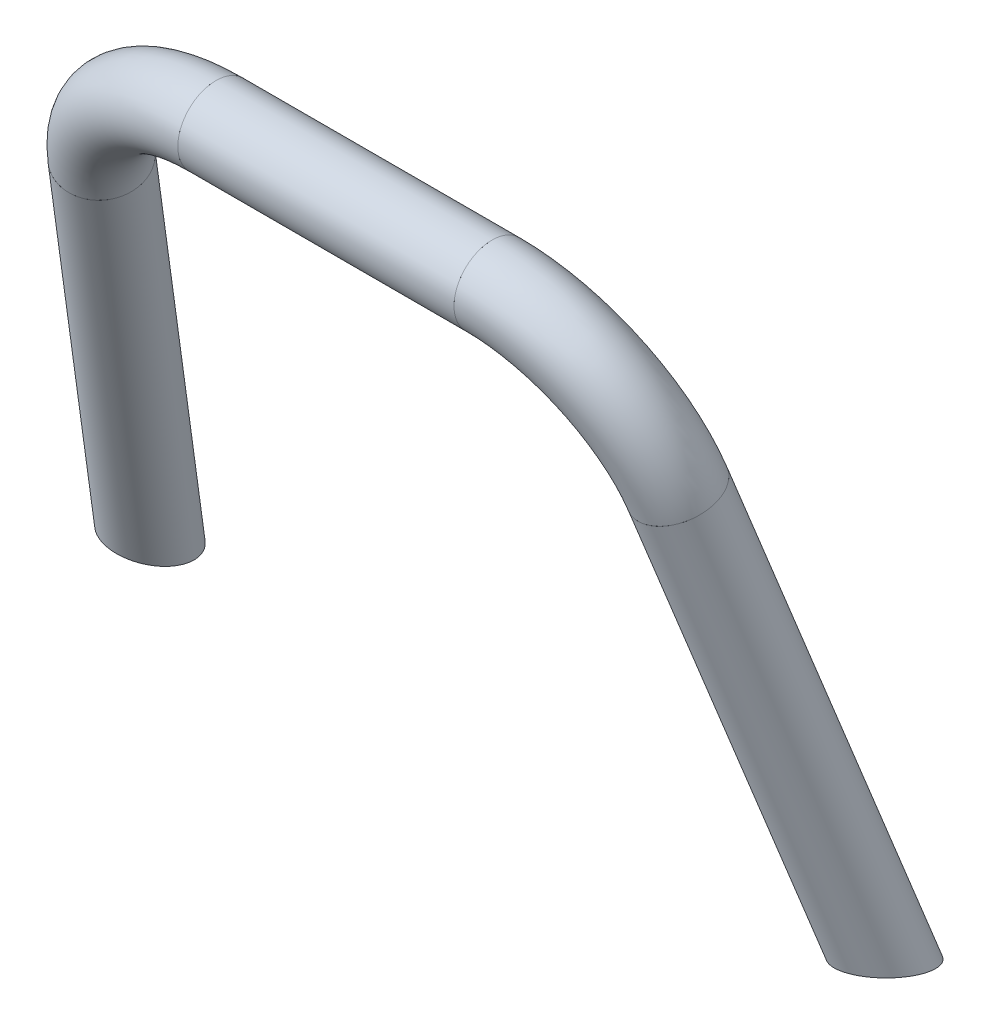
ISO-10303-21;
HEADER;
FILE_DESCRIPTION(('STEP AP214'),'2;1');
FILE_NAME('part.step','',(''),(''),'','','');
FILE_SCHEMA(('AUTOMOTIVE_DESIGN { 1 0 10303 214 1 1 1 1 }'));
ENDSEC;
DATA;
#1=APPLICATION_CONTEXT('core data for automotive mechanical design processes');
#2=APPLICATION_PROTOCOL_DEFINITION('international standard','automotive_design',2000,#1);
#3=PRODUCT_CONTEXT('',#1,'mechanical');
#4=PRODUCT('Part','Part','',(#3));
#5=PRODUCT_RELATED_PRODUCT_CATEGORY('part','',(#4));
#6=PRODUCT_DEFINITION_FORMATION('','',#4);
#7=PRODUCT_DEFINITION_CONTEXT('part definition',#1,'design');
#8=PRODUCT_DEFINITION('design','',#6,#7);
#9=PRODUCT_DEFINITION_SHAPE('','',#8);
#10=(LENGTH_UNIT() NAMED_UNIT(*) SI_UNIT(.MILLI.,.METRE.));
#11=(NAMED_UNIT(*) PLANE_ANGLE_UNIT() SI_UNIT($,.RADIAN.));
#12=(NAMED_UNIT(*) SI_UNIT($,.STERADIAN.) SOLID_ANGLE_UNIT());
#13=UNCERTAINTY_MEASURE_WITH_UNIT(LENGTH_MEASURE(1.E-05),#10,'distance_accuracy_value','');
#14=(GEOMETRIC_REPRESENTATION_CONTEXT(3) GLOBAL_UNCERTAINTY_ASSIGNED_CONTEXT((#13)) GLOBAL_UNIT_ASSIGNED_CONTEXT((#10,
#11,#12)) REPRESENTATION_CONTEXT('',''));
#15=CARTESIAN_POINT('',(0.,0.,0.));
#16=DIRECTION('',(0.,0.,1.));
#17=DIRECTION('',(1.,0.,0.));
#18=AXIS2_PLACEMENT_3D('',#15,#16,#17);
#19=CARTESIAN_POINT('',(72.0514794419109,-176.256250492202,554.703302731316));
#20=DIRECTION('',(0.173648177666935,-0.944253108639308,-0.279700513438851));
#21=DIRECTION('',(0.,0.284015344703917,-0.958819734868198));
#22=AXIS2_PLACEMENT_3D('',#19,#20,#21);
#23=CYLINDRICAL_SURFACE('',#22,6.35);
#24=CARTESIAN_POINT('',(72.0514794419109,-176.256250492202,554.703302731316));
#25=DIRECTION('',(-0.17364817766693,0.944253108639308,0.279700513438852));
#26=DIRECTION('',(0.,-0.284015344703918,0.958819734868197));
#27=AXIS2_PLACEMENT_3D('',#24,#25,#26);
#28=CIRCLE('',#27,6.35);
#29=CARTESIAN_POINT('',(72.0514794419109,-178.059747931072,560.791808047729));
#30=VERTEX_POINT('',#29);
#31=EDGE_CURVE('E66',#30,#30,#28,.T.);
#32=ORIENTED_EDGE('',*,*,#31,.T.);
#33=EDGE_LOOP('',(#32));
#34=FACE_BOUND('',#33,.T.);
#35=CARTESIAN_POINT('',(91.8525605331784,-283.929320408954,522.809086377979));
#36=DIRECTION('',(0.147129774889394,-0.962213086003595,0.229126180224866));
#37=DIRECTION('',(0.0925781956560799,-0.217233957131661,-0.971719447967359));
#38=AXIS2_PLACEMENT_3D('',#35,#36,#37);
#39=ELLIPSE('',#38,7.2985585931813,6.35);
#40=CARTESIAN_POINT('',(92.5282479186253,-285.514815173508,515.716935050855));
#41=VERTEX_POINT('',#40);
#42=EDGE_CURVE('E53',#41,#41,#39,.T.);
#43=ORIENTED_EDGE('',*,*,#42,.T.);
#44=EDGE_LOOP('',(#43));
#45=FACE_BOUND('',#44,.T.);
#46=ADVANCED_FACE('F49',(#34,#45),#23,.F.);
#47=CARTESIAN_POINT('',(72.0514794419109,-176.256250492202,554.703302731316));
#48=DIRECTION('',(0.173648177666935,-0.944253108639308,-0.279700513438851));
#49=DIRECTION('',(0.,0.284015344703917,-0.958819734868198));
#50=AXIS2_PLACEMENT_3D('',#47,#48,#49);
#51=CYLINDRICAL_SURFACE('',#50,9.525);
#52=CARTESIAN_POINT('',(72.0514794419109,-176.256250492202,554.703302731316));
#53=DIRECTION('',(-0.17364817766693,0.944253108639308,0.279700513438852));
#54=DIRECTION('',(0.,-0.284015344703918,0.958819734868197));
#55=AXIS2_PLACEMENT_3D('',#52,#53,#54);
#56=CIRCLE('',#55,9.525);
#57=CARTESIAN_POINT('',(72.0514794419109,-178.961496650507,563.836060705935));
#58=VERTEX_POINT('',#57);
#59=EDGE_CURVE('E58',#58,#58,#56,.T.);
#60=ORIENTED_EDGE('',*,*,#59,.F.);
#61=EDGE_LOOP('',(#60));
#62=FACE_BOUND('',#61,.T.);
#63=CARTESIAN_POINT('',(91.8525605331784,-283.929320408954,522.809086377979));
#64=DIRECTION('',(0.147129774889394,-0.962213086003595,0.229126180224866));
#65=DIRECTION('',(0.0925781956560799,-0.217233957131661,-0.971719447967359));
#66=AXIS2_PLACEMENT_3D('',#63,#64,#65);
#67=ELLIPSE('',#66,10.9478378897719,9.525);
#68=CARTESIAN_POINT('',(92.8660916113488,-286.307562555785,512.170859387294));
#69=VERTEX_POINT('',#68);
#70=EDGE_CURVE('E11',#69,#69,#67,.T.);
#71=ORIENTED_EDGE('',*,*,#70,.F.);
#72=EDGE_LOOP('',(#71));
#73=FACE_BOUND('',#72,.T.);
#74=ADVANCED_FACE('F80',(#62,#73),#51,.T.);
#75=CARTESIAN_POINT('',(72.0514794419109,-176.256250492202,554.703302731316));
#76=DIRECTION('',(-0.17364817766693,0.944253108639308,0.279700513438852));
#77=DIRECTION('',(0.,-0.284015344703918,0.958819734868197));
#78=AXIS2_PLACEMENT_3D('',#75,#76,#77);
#79=PLANE('',#78);
#80=ORIENTED_EDGE('',*,*,#31,.F.);
#81=EDGE_LOOP('',(#80));
#82=FACE_BOUND('',#81,.T.);
#83=ORIENTED_EDGE('',*,*,#59,.T.);
#84=EDGE_LOOP('',(#83));
#85=FACE_BOUND('',#84,.T.);
#86=ADVANCED_FACE('F76',(#82,#85),#79,.T.);
#87=CARTESIAN_POINT('',(100.732882896863,-281.193046525252,528.597681579852));
#88=DIRECTION('',(0.147129774889394,-0.962213086003595,0.229126180224866));
#89=DIRECTION('',(0.,-0.231647150536709,-0.972799875435964));
#90=AXIS2_PLACEMENT_3D('',#87,#88,#89);
#91=PLANE('',#90);
#92=ORIENTED_EDGE('',*,*,#42,.F.);
#93=EDGE_LOOP('',(#92));
#94=FACE_BOUND('',#93,.T.);
#95=ORIENTED_EDGE('',*,*,#70,.T.);
#96=EDGE_LOOP('',(#95));
#97=FACE_BOUND('',#96,.T.);
#98=ADVANCED_FACE('F51',(#94,#97),#91,.T.);
#99=CLOSED_SHELL('',(#46,#74,#86,#98));
#100=MANIFOLD_SOLID_BREP('B2',#99);
#101=CARTESIAN_POINT('',(34.5303040521457,-182.599797609666,552.824258469195));
#102=DIRECTION('',(0.,0.284015344703917,-0.958819734868197));
#103=DIRECTION('',(0.,0.958819734868196,0.284015344703916));
#104=AXIS2_PLACEMENT_3D('',#101,#102,#103);
#105=TOROIDAL_SURFACE('',#104,38.1,6.35);
#106=CARTESIAN_POINT('',(34.5303040521459,-146.068765711187,563.645243102415));
#107=DIRECTION('',(-1.,0.,0.));
#108=DIRECTION('',(0.,-1.,0.));
#109=AXIS2_PLACEMENT_3D('',#106,#107,#108);
#110=CIRCLE('',#109,6.35);
#111=CARTESIAN_POINT('',(34.5303040521459,-139.980260394774,565.448740541284));
#112=VERTEX_POINT('',#111);
#113=EDGE_CURVE('E140',#112,#112,#110,.F.);
#114=CARTESIAN_POINT('',(72.0514794419109,-176.256250492202,554.703302731316));
#115=DIRECTION('',(0.173648177666929,-0.94425310863931,-0.279700513438852));
#116=DIRECTION('',(0.,0.284015344703918,-0.958819734868197));
#117=AXIS2_PLACEMENT_3D('',#114,#115,#116);
#118=CIRCLE('',#117,6.35);
#119=CARTESIAN_POINT('',(78.3050086735384,-175.198992639292,555.016476775002));
#120=VERTEX_POINT('',#119);
#121=EDGE_CURVE('E48',#120,#120,#118,.F.);
#122=CARTESIAN_POINT('',(34.5303040521457,-182.599797609666,552.824258469195));
#123=DIRECTION('',(0.,0.284015344703917,-0.958819734868197));
#124=DIRECTION('',(0.,0.958819734868196,0.284015344703916));
#125=AXIS2_PLACEMENT_3D('',#122,#123,#124);
#126=CIRCLE('',#125,44.45);
#127=EDGE_CURVE('',#112,#120,#126,.T.);
#128=ORIENTED_EDGE('',*,*,#113,.F.);
#129=ORIENTED_EDGE('',*,*,#121,.F.);
#130=ORIENTED_EDGE('',*,*,#127,.T.);
#131=ORIENTED_EDGE('',*,*,#127,.F.);
#132=EDGE_LOOP('',(#128,#130,#129,#131));
#133=FACE_BOUND('',#132,.T.);
#134=ADVANCED_FACE('F126',(#133),#105,.F.);
#135=CARTESIAN_POINT('',(34.5303040521457,-182.599797609666,552.824258469195));
#136=DIRECTION('',(0.,0.284015344703917,-0.958819734868197));
#137=DIRECTION('',(0.,0.958819734868196,0.284015344703916));
#138=AXIS2_PLACEMENT_3D('',#135,#136,#137);
#139=TOROIDAL_SURFACE('',#138,38.1,9.525);
#140=CARTESIAN_POINT('',(34.5303040521459,-146.068765711187,563.645243102415));
#141=DIRECTION('',(-1.,0.,0.));
#142=DIRECTION('',(0.,-1.,0.));
#143=AXIS2_PLACEMENT_3D('',#140,#141,#142);
#144=CIRCLE('',#143,9.525);
#145=CARTESIAN_POINT('',(34.5303040521459,-136.936007736568,566.350489260719));
#146=VERTEX_POINT('',#145);
#147=EDGE_CURVE('E146',#146,#146,#144,.T.);
#148=CARTESIAN_POINT('',(72.0514794419109,-176.256250492202,554.703302731316));
#149=DIRECTION('',(0.173648177666929,-0.94425310863931,-0.279700513438852));
#150=DIRECTION('',(0.,0.284015344703918,-0.958819734868197));
#151=AXIS2_PLACEMENT_3D('',#148,#149,#150);
#152=CIRCLE('',#151,9.525);
#153=CARTESIAN_POINT('',(81.4317732893521,-174.670363712836,555.173063796846));
#154=VERTEX_POINT('',#153);
#155=EDGE_CURVE('E134',#154,#154,#152,.T.);
#156=CARTESIAN_POINT('',(34.5303040521457,-182.599797609666,552.824258469195));
#157=DIRECTION('',(0.,0.284015344703917,-0.958819734868197));
#158=DIRECTION('',(0.,0.958819734868196,0.284015344703916));
#159=AXIS2_PLACEMENT_3D('',#156,#157,#158);
#160=CIRCLE('',#159,47.625);
#161=EDGE_CURVE('',#146,#154,#160,.T.);
#162=ORIENTED_EDGE('',*,*,#147,.F.);
#163=ORIENTED_EDGE('',*,*,#155,.F.);
#164=ORIENTED_EDGE('',*,*,#161,.T.);
#165=ORIENTED_EDGE('',*,*,#161,.F.);
#166=EDGE_LOOP('',(#162,#164,#163,#165));
#167=FACE_BOUND('',#166,.T.);
#168=ADVANCED_FACE('F154',(#167),#139,.T.);
#169=CARTESIAN_POINT('',(34.5303040521458,-146.068765711187,563.645243102414));
#170=DIRECTION('',(-1.,0.,0.));
#171=DIRECTION('',(0.,-1.,0.));
#172=AXIS2_PLACEMENT_3D('',#169,#170,#171);
#173=PLANE('',#172);
#174=ORIENTED_EDGE('',*,*,#147,.T.);
#175=EDGE_LOOP('',(#174));
#176=FACE_BOUND('',#175,.T.);
#177=ORIENTED_EDGE('',*,*,#113,.T.);
#178=EDGE_LOOP('',(#177));
#179=FACE_BOUND('',#178,.T.);
#180=ADVANCED_FACE('F151',(#176,#179),#173,.T.);
#181=CARTESIAN_POINT('',(72.0514794419109,-176.256250492202,554.703302731316));
#182=DIRECTION('',(0.173648177666929,-0.94425310863931,-0.279700513438852));
#183=DIRECTION('',(0.,0.284015344703918,-0.958819734868197));
#184=AXIS2_PLACEMENT_3D('',#181,#182,#183);
#185=PLANE('',#184);
#186=ORIENTED_EDGE('',*,*,#155,.T.);
#187=EDGE_LOOP('',(#186));
#188=FACE_BOUND('',#187,.T.);
#189=ORIENTED_EDGE('',*,*,#121,.T.);
#190=EDGE_LOOP('',(#189));
#191=FACE_BOUND('',#190,.T.);
#192=ADVANCED_FACE('F128',(#188,#191),#185,.T.);
#193=CLOSED_SHELL('',(#134,#168,#180,#192));
#194=MANIFOLD_SOLID_BREP('B6',#193);
#195=CARTESIAN_POINT('',(-34.5303040521456,-146.068765711187,563.645243102414));
#196=DIRECTION('',(1.,0.,0.));
#197=DIRECTION('',(0.,0.,-1.));
#198=AXIS2_PLACEMENT_3D('',#195,#196,#197);
#199=CYLINDRICAL_SURFACE('',#198,6.35);
#200=CARTESIAN_POINT('',(-34.5303040521458,-146.068765711187,563.645243102414));
#201=DIRECTION('',(-1.,0.,0.));
#202=DIRECTION('',(0.,-1.,0.));
#203=AXIS2_PLACEMENT_3D('',#200,#201,#202);
#204=CIRCLE('',#203,6.35);
#205=CARTESIAN_POINT('',(-34.5303040521458,-152.418765711187,563.645243102414));
#206=VERTEX_POINT('',#205);
#207=EDGE_CURVE('E220',#206,#206,#204,.T.);
#208=ORIENTED_EDGE('',*,*,#207,.T.);
#209=EDGE_LOOP('',(#208));
#210=FACE_BOUND('',#209,.T.);
#211=CARTESIAN_POINT('',(34.5303040521458,-146.068765711187,563.645243102414));
#212=DIRECTION('',(1.,0.,0.));
#213=DIRECTION('',(0.,1.,0.));
#214=AXIS2_PLACEMENT_3D('',#211,#212,#213);
#215=CIRCLE('',#214,6.35);
#216=CARTESIAN_POINT('',(34.5303040521458,-139.718765711187,563.645243102414));
#217=VERTEX_POINT('',#216);
#218=EDGE_CURVE('E207',#217,#217,#215,.T.);
#219=ORIENTED_EDGE('',*,*,#218,.T.);
#220=EDGE_LOOP('',(#219));
#221=FACE_BOUND('',#220,.T.);
#222=ADVANCED_FACE('F203',(#210,#221),#199,.F.);
#223=CARTESIAN_POINT('',(-34.5303040521456,-146.068765711187,563.645243102414));
#224=DIRECTION('',(1.,0.,0.));
#225=DIRECTION('',(0.,0.,-1.));
#226=AXIS2_PLACEMENT_3D('',#223,#224,#225);
#227=CYLINDRICAL_SURFACE('',#226,9.525);
#228=CARTESIAN_POINT('',(-34.5303040521458,-146.068765711187,563.645243102414));
#229=DIRECTION('',(-1.,0.,0.));
#230=DIRECTION('',(0.,-1.,0.));
#231=AXIS2_PLACEMENT_3D('',#228,#229,#230);
#232=CIRCLE('',#231,9.525);
#233=CARTESIAN_POINT('',(-34.5303040521458,-155.593765711187,563.645243102414));
#234=VERTEX_POINT('',#233);
#235=EDGE_CURVE('E212',#234,#234,#232,.T.);
#236=ORIENTED_EDGE('',*,*,#235,.F.);
#237=EDGE_LOOP('',(#236));
#238=FACE_BOUND('',#237,.T.);
#239=CARTESIAN_POINT('',(34.5303040521458,-146.068765711187,563.645243102414));
#240=DIRECTION('',(1.,0.,0.));
#241=DIRECTION('',(0.,1.,0.));
#242=AXIS2_PLACEMENT_3D('',#239,#240,#241);
#243=CIRCLE('',#242,9.525);
#244=CARTESIAN_POINT('',(34.5303040521458,-136.543765711187,563.645243102414));
#245=VERTEX_POINT('',#244);
#246=EDGE_CURVE('E125',#245,#245,#243,.T.);
#247=ORIENTED_EDGE('',*,*,#246,.F.);
#248=EDGE_LOOP('',(#247));
#249=FACE_BOUND('',#248,.T.);
#250=ADVANCED_FACE('F234',(#238,#249),#227,.T.);
#251=CARTESIAN_POINT('',(-34.5303040521458,-146.068765711187,563.645243102414));
#252=DIRECTION('',(-1.,0.,0.));
#253=DIRECTION('',(0.,-1.,0.));
#254=AXIS2_PLACEMENT_3D('',#251,#252,#253);
#255=PLANE('',#254);
#256=ORIENTED_EDGE('',*,*,#207,.F.);
#257=EDGE_LOOP('',(#256));
#258=FACE_BOUND('',#257,.T.);
#259=ORIENTED_EDGE('',*,*,#235,.T.);
#260=EDGE_LOOP('',(#259));
#261=FACE_BOUND('',#260,.T.);
#262=ADVANCED_FACE('F230',(#258,#261),#255,.T.);
#263=CARTESIAN_POINT('',(34.5303040521458,-146.068765711187,563.645243102414));
#264=DIRECTION('',(1.,0.,0.));
#265=DIRECTION('',(0.,1.,0.));
#266=AXIS2_PLACEMENT_3D('',#263,#264,#265);
#267=PLANE('',#266);
#268=ORIENTED_EDGE('',*,*,#218,.F.);
#269=EDGE_LOOP('',(#268));
#270=FACE_BOUND('',#269,.T.);
#271=ORIENTED_EDGE('',*,*,#246,.T.);
#272=EDGE_LOOP('',(#271));
#273=FACE_BOUND('',#272,.T.);
#274=ADVANCED_FACE('F205',(#270,#273),#267,.T.);
#275=CLOSED_SHELL('',(#222,#250,#262,#274));
#276=MANIFOLD_SOLID_BREP('B43',#275);
#277=CARTESIAN_POINT('',(-34.5303040521457,-182.599797609665,552.824258469195));
#278=DIRECTION('',(0.,-0.284015344703916,0.958819734868197));
#279=DIRECTION('',(0.,-0.958819734868196,-0.284015344703916));
#280=AXIS2_PLACEMENT_3D('',#277,#278,#279);
#281=TOROIDAL_SURFACE('',#280,38.1000000000001,6.35);
#282=CARTESIAN_POINT('',(-34.5303040521456,-146.068765711187,563.645243102414));
#283=DIRECTION('',(1.,0.,0.));
#284=DIRECTION('',(0.,1.,0.));
#285=AXIS2_PLACEMENT_3D('',#282,#283,#284);
#286=CIRCLE('',#285,6.35);
#287=CARTESIAN_POINT('',(-34.5303040521456,-139.980260394774,565.448740541284));
#288=VERTEX_POINT('',#287);
#289=EDGE_CURVE('E292',#288,#288,#286,.T.);
#290=CARTESIAN_POINT('',(-72.051479441911,-176.256250492202,554.703302731316));
#291=DIRECTION('',(-0.173648177666934,-0.944253108639308,-0.279700513438851));
#292=DIRECTION('',(0.,0.284015344703916,-0.958819734868197));
#293=AXIS2_PLACEMENT_3D('',#290,#291,#292);
#294=CIRCLE('',#293,6.35);
#295=CARTESIAN_POINT('',(-78.3050086735384,-175.198992639292,555.016476775002));
#296=VERTEX_POINT('',#295);
#297=EDGE_CURVE('E202',#296,#296,#294,.T.);
#298=CARTESIAN_POINT('',(-34.5303040521457,-182.599797609665,552.824258469195));
#299=DIRECTION('',(0.,-0.284015344703916,0.958819734868197));
#300=DIRECTION('',(0.,-0.958819734868196,-0.284015344703916));
#301=AXIS2_PLACEMENT_3D('',#298,#299,#300);
#302=CIRCLE('',#301,44.4500000000001);
#303=EDGE_CURVE('',#288,#296,#302,.T.);
#304=ORIENTED_EDGE('',*,*,#289,.T.);
#305=ORIENTED_EDGE('',*,*,#297,.T.);
#306=ORIENTED_EDGE('',*,*,#303,.T.);
#307=ORIENTED_EDGE('',*,*,#303,.F.);
#308=EDGE_LOOP('',(#304,#306,#305,#307));
#309=FACE_BOUND('',#308,.T.);
#310=ADVANCED_FACE('F279',(#309),#281,.F.);
#311=CARTESIAN_POINT('',(-72.0514794419109,-176.256250492202,554.703302731316));
#312=DIRECTION('',(-0.173648177666934,-0.944253108639308,-0.279700513438851));
#313=DIRECTION('',(0.,0.284015344703916,-0.958819734868197));
#314=AXIS2_PLACEMENT_3D('',#311,#312,#313);
#315=PLANE('',#314);
#316=ORIENTED_EDGE('',*,*,#297,.F.);
#317=EDGE_LOOP('',(#316));
#318=FACE_BOUND('',#317,.T.);
#319=CARTESIAN_POINT('',(-72.051479441911,-176.256250492202,554.703302731316));
#320=DIRECTION('',(-0.173648177666934,-0.944253108639308,-0.279700513438851));
#321=DIRECTION('',(0.,0.284015344703916,-0.958819734868197));
#322=AXIS2_PLACEMENT_3D('',#319,#320,#321);
#323=CIRCLE('',#322,9.525);
#324=CARTESIAN_POINT('',(-81.4317732893522,-174.670363712836,555.173063796846));
#325=VERTEX_POINT('',#324);
#326=EDGE_CURVE('E286',#325,#325,#323,.F.);
#327=ORIENTED_EDGE('',*,*,#326,.F.);
#328=EDGE_LOOP('',(#327));
#329=FACE_BOUND('',#328,.T.);
#330=ADVANCED_FACE('F312',(#318,#329),#315,.T.);
#331=CARTESIAN_POINT('',(-34.5303040521457,-182.599797609665,552.824258469195));
#332=DIRECTION('',(0.,-0.284015344703916,0.958819734868197));
#333=DIRECTION('',(0.,-0.958819734868196,-0.284015344703916));
#334=AXIS2_PLACEMENT_3D('',#331,#332,#333);
#335=TOROIDAL_SURFACE('',#334,38.1000000000001,9.525);
#336=CARTESIAN_POINT('',(-34.5303040521456,-146.068765711187,563.645243102414));
#337=DIRECTION('',(1.,0.,0.));
#338=DIRECTION('',(0.,1.,0.));
#339=AXIS2_PLACEMENT_3D('',#336,#337,#338);
#340=CIRCLE('',#339,9.525);
#341=CARTESIAN_POINT('',(-34.5303040521456,-136.936007736568,566.350489260719));
#342=VERTEX_POINT('',#341);
#343=EDGE_CURVE('E296',#342,#342,#340,.F.);
#344=CARTESIAN_POINT('',(-34.5303040521457,-182.599797609665,552.824258469195));
#345=DIRECTION('',(0.,-0.284015344703916,0.958819734868197));
#346=DIRECTION('',(0.,-0.958819734868196,-0.284015344703916));
#347=AXIS2_PLACEMENT_3D('',#344,#345,#346);
#348=CIRCLE('',#347,47.6250000000001);
#349=EDGE_CURVE('',#342,#325,#348,.T.);
#350=ORIENTED_EDGE('',*,*,#343,.T.);
#351=ORIENTED_EDGE('',*,*,#326,.T.);
#352=ORIENTED_EDGE('',*,*,#349,.T.);
#353=ORIENTED_EDGE('',*,*,#349,.F.);
#354=EDGE_LOOP('',(#350,#352,#351,#353));
#355=FACE_BOUND('',#354,.T.);
#356=ADVANCED_FACE('F303',(#355),#335,.T.);
#357=CARTESIAN_POINT('',(-34.5303040521458,-146.068765711187,563.645243102414));
#358=DIRECTION('',(1.,0.,0.));
#359=DIRECTION('',(0.,1.,0.));
#360=AXIS2_PLACEMENT_3D('',#357,#358,#359);
#361=PLANE('',#360);
#362=ORIENTED_EDGE('',*,*,#289,.F.);
#363=EDGE_LOOP('',(#362));
#364=FACE_BOUND('',#363,.T.);
#365=ORIENTED_EDGE('',*,*,#343,.F.);
#366=EDGE_LOOP('',(#365));
#367=FACE_BOUND('',#366,.T.);
#368=ADVANCED_FACE('F305',(#364,#367),#361,.T.);
#369=CLOSED_SHELL('',(#310,#330,#356,#368));
#370=MANIFOLD_SOLID_BREP('B120',#369);
#371=CARTESIAN_POINT('',(-89.9514884342265,-273.591790448657,525.871202256794));
#372=DIRECTION('',(0.173648177666935,0.944253108639307,0.279700513438851));
#373=DIRECTION('',(0.,-0.284015344703916,0.958819734868198));
#374=AXIS2_PLACEMENT_3D('',#371,#372,#373);
#375=CYLINDRICAL_SURFACE('',#374,6.35);
#376=CARTESIAN_POINT('',(-91.8525605331784,-283.929320408954,522.809086377979));
#377=DIRECTION('',(-0.147129774889401,-0.962213086003592,0.229126180224865));
#378=DIRECTION('',(0.0925781956560674,0.217233957131662,0.97171944796736));
#379=AXIS2_PLACEMENT_3D('',#376,#377,#378);
#380=ELLIPSE('',#379,7.29855859318129,6.35);
#381=CARTESIAN_POINT('',(-91.1768731477316,-282.3438256444,529.901237705103));
#382=VERTEX_POINT('',#381);
#383=EDGE_CURVE('E366',#382,#382,#380,.T.);
#384=ORIENTED_EDGE('',*,*,#383,.T.);
#385=EDGE_LOOP('',(#384));
#386=FACE_BOUND('',#385,.T.);
#387=CARTESIAN_POINT('',(-72.0514794419109,-176.256250492202,554.703302731316));
#388=DIRECTION('',(0.173648177666935,0.944253108639307,0.279700513438851));
#389=DIRECTION('',(0.,-0.284015344703916,0.958819734868198));
#390=AXIS2_PLACEMENT_3D('',#387,#388,#389);
#391=CIRCLE('',#390,6.35);
#392=CARTESIAN_POINT('',(-72.0514794419109,-178.059747931072,560.791808047729));
#393=VERTEX_POINT('',#392);
#394=EDGE_CURVE('E352',#393,#393,#391,.T.);
#395=ORIENTED_EDGE('',*,*,#394,.T.);
#396=EDGE_LOOP('',(#395));
#397=FACE_BOUND('',#396,.T.);
#398=ADVANCED_FACE('F348',(#386,#397),#375,.F.);
#399=CARTESIAN_POINT('',(-89.9514884342265,-273.591790448657,525.871202256794));
#400=DIRECTION('',(0.173648177666935,0.944253108639307,0.279700513438851));
#401=DIRECTION('',(0.,-0.284015344703916,0.958819734868198));
#402=AXIS2_PLACEMENT_3D('',#399,#400,#401);
#403=CYLINDRICAL_SURFACE('',#402,9.525);
#404=CARTESIAN_POINT('',(-91.8525605331784,-283.929320408954,522.809086377979));
#405=DIRECTION('',(-0.147129774889401,-0.962213086003592,0.229126180224865));
#406=DIRECTION('',(0.0925781956560674,0.217233957131662,0.97171944796736));
#407=AXIS2_PLACEMENT_3D('',#404,#405,#406);
#408=ELLIPSE('',#407,10.9478378897719,9.525);
#409=CARTESIAN_POINT('',(-90.8390294550082,-281.551078262122,533.447313368664));
#410=VERTEX_POINT('',#409);
#411=EDGE_CURVE('E357',#410,#410,#408,.T.);
#412=ORIENTED_EDGE('',*,*,#411,.F.);
#413=EDGE_LOOP('',(#412));
#414=FACE_BOUND('',#413,.T.);
#415=CARTESIAN_POINT('',(-72.0514794419109,-176.256250492202,554.703302731316));
#416=DIRECTION('',(0.173648177666935,0.944253108639307,0.279700513438851));
#417=DIRECTION('',(0.,-0.284015344703916,0.958819734868198));
#418=AXIS2_PLACEMENT_3D('',#415,#416,#417);
#419=CIRCLE('',#418,9.525);
#420=CARTESIAN_POINT('',(-72.0514794419109,-178.961496650507,563.836060705935));
#421=VERTEX_POINT('',#420);
#422=EDGE_CURVE('E278',#421,#421,#419,.T.);
#423=ORIENTED_EDGE('',*,*,#422,.F.);
#424=EDGE_LOOP('',(#423));
#425=FACE_BOUND('',#424,.T.);
#426=ADVANCED_FACE('F379',(#414,#425),#403,.T.);
#427=CARTESIAN_POINT('',(-81.9729161832334,-284.320693660431,527.509576667019));
#428=DIRECTION('',(-0.147129774889401,-0.962213086003592,0.229126180224865));
#429=DIRECTION('',(0.,-0.231647150536708,-0.972799875435965));
#430=AXIS2_PLACEMENT_3D('',#427,#428,#429);
#431=PLANE('',#430);
#432=ORIENTED_EDGE('',*,*,#383,.F.);
#433=EDGE_LOOP('',(#432));
#434=FACE_BOUND('',#433,.T.);
#435=ORIENTED_EDGE('',*,*,#411,.T.);
#436=EDGE_LOOP('',(#435));
#437=FACE_BOUND('',#436,.T.);
#438=ADVANCED_FACE('F375',(#434,#437),#431,.T.);
#439=CARTESIAN_POINT('',(-72.0514794419109,-176.256250492202,554.703302731316));
#440=DIRECTION('',(0.173648177666935,0.944253108639307,0.279700513438851));
#441=DIRECTION('',(0.,-0.284015344703916,0.958819734868198));
#442=AXIS2_PLACEMENT_3D('',#439,#440,#441);
#443=PLANE('',#442);
#444=ORIENTED_EDGE('',*,*,#394,.F.);
#445=EDGE_LOOP('',(#444));
#446=FACE_BOUND('',#445,.T.);
#447=ORIENTED_EDGE('',*,*,#422,.T.);
#448=EDGE_LOOP('',(#447));
#449=FACE_BOUND('',#448,.T.);
#450=ADVANCED_FACE('F350',(#446,#449),#443,.T.);
#451=CLOSED_SHELL('',(#398,#426,#438,#450));
#452=MANIFOLD_SOLID_BREP('B197',#451);
#453=ADVANCED_BREP_SHAPE_REPRESENTATION('',(#18,#100,#194,#276,#370,#452),#14);
#454=SHAPE_DEFINITION_REPRESENTATION(#9,#453);
ENDSEC;
END-ISO-10303-21;
